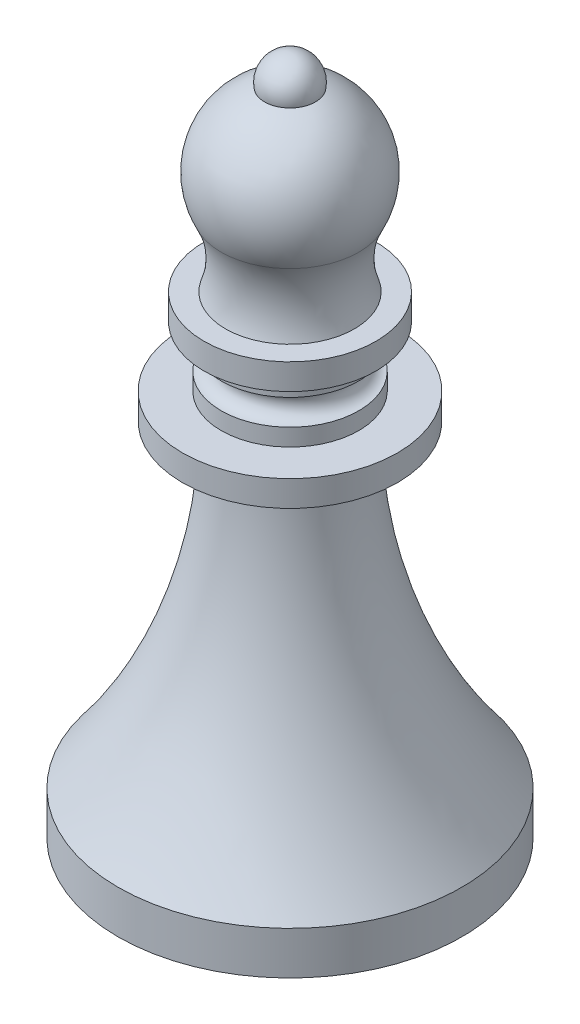
ISO-10303-21;
HEADER;
FILE_DESCRIPTION(('STEP AP214'),'2;1');
FILE_NAME('part.step','',(''),(''),'','','');
FILE_SCHEMA(('AUTOMOTIVE_DESIGN { 1 0 10303 214 1 1 1 1 }'));
ENDSEC;
DATA;
#1=APPLICATION_CONTEXT('core data for automotive mechanical design processes');
#2=APPLICATION_PROTOCOL_DEFINITION('international standard','automotive_design',2000,#1);
#3=PRODUCT_CONTEXT('',#1,'mechanical');
#4=PRODUCT('Part','Part','',(#3));
#5=PRODUCT_RELATED_PRODUCT_CATEGORY('part','',(#4));
#6=PRODUCT_DEFINITION_FORMATION('','',#4);
#7=PRODUCT_DEFINITION_CONTEXT('part definition',#1,'design');
#8=PRODUCT_DEFINITION('design','',#6,#7);
#9=PRODUCT_DEFINITION_SHAPE('','',#8);
#10=(LENGTH_UNIT() NAMED_UNIT(*) SI_UNIT(.MILLI.,.METRE.));
#11=(NAMED_UNIT(*) PLANE_ANGLE_UNIT() SI_UNIT($,.RADIAN.));
#12=(NAMED_UNIT(*) SI_UNIT($,.STERADIAN.) SOLID_ANGLE_UNIT());
#13=UNCERTAINTY_MEASURE_WITH_UNIT(LENGTH_MEASURE(1.E-05),#10,'distance_accuracy_value','');
#14=(GEOMETRIC_REPRESENTATION_CONTEXT(3) GLOBAL_UNCERTAINTY_ASSIGNED_CONTEXT((#13)) GLOBAL_UNIT_ASSIGNED_CONTEXT((#10,
#11,#12)) REPRESENTATION_CONTEXT('',''));
#15=CARTESIAN_POINT('',(0.,0.,0.));
#16=DIRECTION('',(0.,0.,1.));
#17=DIRECTION('',(1.,0.,0.));
#18=AXIS2_PLACEMENT_3D('',#15,#16,#17);
#19=CARTESIAN_POINT('',(0.,-0.204926779867239,0.));
#20=DIRECTION('',(0.,1.,0.));
#21=DIRECTION('',(0.,0.,1.));
#22=AXIS2_PLACEMENT_3D('',#19,#20,#21);
#23=TOROIDAL_SURFACE('',#22,40.4994167315929,36.);
#24=CARTESIAN_POINT('',(0.,-1.23431286965975,0.));
#25=DIRECTION('',(0.,1.,0.));
#26=DIRECTION('',(0.,0.,1.));
#27=AXIS2_PLACEMENT_3D('',#24,#25,#26);
#28=CIRCLE('',#27,4.51413690388919);
#29=CARTESIAN_POINT('',(0.,-1.23431286965975,4.51413690388919));
#30=VERTEX_POINT('',#29);
#31=EDGE_CURVE('E10',#30,#30,#28,.F.);
#32=ORIENTED_EDGE('',*,*,#31,.T.);
#33=EDGE_LOOP('',(#32));
#34=FACE_BOUND('',#33,.T.);
#35=CARTESIAN_POINT('',(0.,-22.2,0.));
#36=DIRECTION('',(0.,1.,0.));
#37=DIRECTION('',(0.,0.,1.));
#38=AXIS2_PLACEMENT_3D('',#35,#36,#37);
#39=CIRCLE('',#38,12.);
#40=CARTESIAN_POINT('',(0.,-22.2,12.));
#41=VERTEX_POINT('',#40);
#42=EDGE_CURVE('E87',#41,#41,#39,.T.);
#43=ORIENTED_EDGE('',*,*,#42,.T.);
#44=EDGE_LOOP('',(#43));
#45=FACE_BOUND('',#44,.T.);
#46=ADVANCED_FACE('F37',(#34,#45),#23,.F.);
#47=CARTESIAN_POINT('',(4.5,0.,0.));
#48=DIRECTION('',(0.,1.,0.));
#49=DIRECTION('',(0.,0.,1.));
#50=AXIS2_PLACEMENT_3D('',#47,#48,#49);
#51=PLANE('',#50);
#52=CARTESIAN_POINT('',(0.,0.,0.));
#53=DIRECTION('',(0.,1.,0.));
#54=DIRECTION('',(0.,0.,1.));
#55=AXIS2_PLACEMENT_3D('',#52,#53,#54);
#56=CIRCLE('',#55,5.71364623147932);
#57=CARTESIAN_POINT('',(0.,0.,5.71364623147932));
#58=VERTEX_POINT('',#57);
#59=EDGE_CURVE('E44',#58,#58,#56,.T.);
#60=ORIENTED_EDGE('',*,*,#59,.T.);
#61=EDGE_LOOP('',(#60));
#62=FACE_BOUND('',#61,.T.);
#63=CARTESIAN_POINT('',(0.,0.,0.));
#64=DIRECTION('',(0.,1.,0.));
#65=DIRECTION('',(0.,0.,1.));
#66=AXIS2_PLACEMENT_3D('',#63,#64,#65);
#67=CIRCLE('',#66,7.5);
#68=CARTESIAN_POINT('',(0.,0.,7.5));
#69=VERTEX_POINT('',#68);
#70=EDGE_CURVE('E48',#69,#69,#67,.T.);
#71=ORIENTED_EDGE('',*,*,#70,.F.);
#72=EDGE_LOOP('',(#71));
#73=FACE_BOUND('',#72,.T.);
#74=ADVANCED_FACE('F109',(#62,#73),#51,.F.);
#75=CARTESIAN_POINT('',(0.,27.858167310788,0.));
#76=DIRECTION('',(0.,1.,0.));
#77=DIRECTION('',(0.,0.,1.));
#78=AXIS2_PLACEMENT_3D('',#75,#76,#77);
#79=CYLINDRICAL_SURFACE('',#78,7.5);
#80=CARTESIAN_POINT('',(0.,1.8,0.));
#81=DIRECTION('',(0.,1.,0.));
#82=DIRECTION('',(0.,0.,1.));
#83=AXIS2_PLACEMENT_3D('',#80,#81,#82);
#84=CIRCLE('',#83,7.5);
#85=CARTESIAN_POINT('',(0.,1.8,7.5));
#86=VERTEX_POINT('',#85);
#87=EDGE_CURVE('E52',#86,#86,#84,.T.);
#88=ORIENTED_EDGE('',*,*,#87,.F.);
#89=EDGE_LOOP('',(#88));
#90=FACE_BOUND('',#89,.T.);
#91=ORIENTED_EDGE('',*,*,#70,.T.);
#92=EDGE_LOOP('',(#91));
#93=FACE_BOUND('',#92,.T.);
#94=ADVANCED_FACE('F113',(#90,#93),#79,.T.);
#95=CARTESIAN_POINT('',(7.5,1.8,0.));
#96=DIRECTION('',(0.,-1.,0.));
#97=DIRECTION('',(0.,0.,-1.));
#98=AXIS2_PLACEMENT_3D('',#95,#96,#97);
#99=PLANE('',#98);
#100=CARTESIAN_POINT('',(0.,1.8,0.));
#101=DIRECTION('',(0.,1.,0.));
#102=DIRECTION('',(0.,0.,1.));
#103=AXIS2_PLACEMENT_3D('',#100,#101,#102);
#104=CIRCLE('',#103,4.8);
#105=CARTESIAN_POINT('',(0.,1.8,4.8));
#106=VERTEX_POINT('',#105);
#107=EDGE_CURVE('E57',#106,#106,#104,.T.);
#108=ORIENTED_EDGE('',*,*,#107,.F.);
#109=EDGE_LOOP('',(#108));
#110=FACE_BOUND('',#109,.T.);
#111=ORIENTED_EDGE('',*,*,#87,.T.);
#112=EDGE_LOOP('',(#111));
#113=FACE_BOUND('',#112,.T.);
#114=ADVANCED_FACE('F118',(#110,#113),#99,.F.);
#115=CARTESIAN_POINT('',(0.,27.858167310788,0.));
#116=DIRECTION('',(0.,1.,0.));
#117=DIRECTION('',(0.,0.,1.));
#118=AXIS2_PLACEMENT_3D('',#115,#116,#117);
#119=CYLINDRICAL_SURFACE('',#118,4.8);
#120=CARTESIAN_POINT('',(0.,3.,0.));
#121=DIRECTION('',(0.,1.,0.));
#122=DIRECTION('',(0.,0.,1.));
#123=AXIS2_PLACEMENT_3D('',#120,#121,#122);
#124=CIRCLE('',#123,4.8);
#125=CARTESIAN_POINT('',(0.,3.,4.8));
#126=VERTEX_POINT('',#125);
#127=EDGE_CURVE('E60',#126,#126,#124,.T.);
#128=ORIENTED_EDGE('',*,*,#127,.F.);
#129=EDGE_LOOP('',(#128));
#130=FACE_BOUND('',#129,.T.);
#131=ORIENTED_EDGE('',*,*,#107,.T.);
#132=EDGE_LOOP('',(#131));
#133=FACE_BOUND('',#132,.T.);
#134=ADVANCED_FACE('F122',(#130,#133),#119,.T.);
#135=CARTESIAN_POINT('',(0.,3.9,0.));
#136=DIRECTION('',(0.,1.,0.));
#137=DIRECTION('',(0.,0.,1.));
#138=AXIS2_PLACEMENT_3D('',#135,#136,#137);
#139=TOROIDAL_SURFACE('',#138,4.8,0.9);
#140=CARTESIAN_POINT('',(0.,4.8,0.));
#141=DIRECTION('',(0.,1.,0.));
#142=DIRECTION('',(0.,0.,1.));
#143=AXIS2_PLACEMENT_3D('',#140,#141,#142);
#144=CIRCLE('',#143,4.80000000000001);
#145=CARTESIAN_POINT('',(0.,4.8,4.80000000000001));
#146=VERTEX_POINT('',#145);
#147=EDGE_CURVE('E63',#146,#146,#144,.T.);
#148=ORIENTED_EDGE('',*,*,#147,.F.);
#149=EDGE_LOOP('',(#148));
#150=FACE_BOUND('',#149,.T.);
#151=ORIENTED_EDGE('',*,*,#127,.T.);
#152=EDGE_LOOP('',(#151));
#153=FACE_BOUND('',#152,.T.);
#154=ADVANCED_FACE('F126',(#150,#153),#139,.F.);
#155=CARTESIAN_POINT('',(0.,27.858167310788,0.));
#156=DIRECTION('',(0.,1.,0.));
#157=DIRECTION('',(0.,0.,1.));
#158=AXIS2_PLACEMENT_3D('',#155,#156,#157);
#159=CYLINDRICAL_SURFACE('',#158,4.80000000000001);
#160=CARTESIAN_POINT('',(0.,6.,0.));
#161=DIRECTION('',(0.,1.,0.));
#162=DIRECTION('',(0.,0.,1.));
#163=AXIS2_PLACEMENT_3D('',#160,#161,#162);
#164=CIRCLE('',#163,4.80000000000001);
#165=CARTESIAN_POINT('',(0.,6.,4.80000000000001));
#166=VERTEX_POINT('',#165);
#167=EDGE_CURVE('E66',#166,#166,#164,.T.);
#168=ORIENTED_EDGE('',*,*,#167,.F.);
#169=EDGE_LOOP('',(#168));
#170=FACE_BOUND('',#169,.T.);
#171=ORIENTED_EDGE('',*,*,#147,.T.);
#172=EDGE_LOOP('',(#171));
#173=FACE_BOUND('',#172,.T.);
#174=ADVANCED_FACE('F130',(#170,#173),#159,.T.);
#175=CARTESIAN_POINT('',(4.80000000000001,6.,0.));
#176=DIRECTION('',(0.,1.,0.));
#177=DIRECTION('',(0.,0.,1.));
#178=AXIS2_PLACEMENT_3D('',#175,#176,#177);
#179=PLANE('',#178);
#180=CARTESIAN_POINT('',(0.,6.,0.));
#181=DIRECTION('',(0.,1.,0.));
#182=DIRECTION('',(0.,0.,1.));
#183=AXIS2_PLACEMENT_3D('',#180,#181,#182);
#184=CIRCLE('',#183,6.);
#185=CARTESIAN_POINT('',(0.,6.,6.));
#186=VERTEX_POINT('',#185);
#187=EDGE_CURVE('E69',#186,#186,#184,.T.);
#188=ORIENTED_EDGE('',*,*,#187,.F.);
#189=EDGE_LOOP('',(#188));
#190=FACE_BOUND('',#189,.T.);
#191=ORIENTED_EDGE('',*,*,#167,.T.);
#192=EDGE_LOOP('',(#191));
#193=FACE_BOUND('',#192,.T.);
#194=ADVANCED_FACE('F134',(#190,#193),#179,.F.);
#195=CARTESIAN_POINT('',(0.,27.858167310788,0.));
#196=DIRECTION('',(0.,1.,0.));
#197=DIRECTION('',(0.,0.,1.));
#198=AXIS2_PLACEMENT_3D('',#195,#196,#197);
#199=CYLINDRICAL_SURFACE('',#198,6.);
#200=CARTESIAN_POINT('',(0.,7.8,0.));
#201=DIRECTION('',(0.,1.,0.));
#202=DIRECTION('',(0.,0.,1.));
#203=AXIS2_PLACEMENT_3D('',#200,#201,#202);
#204=CIRCLE('',#203,6.);
#205=CARTESIAN_POINT('',(0.,7.8,6.));
#206=VERTEX_POINT('',#205);
#207=EDGE_CURVE('E72',#206,#206,#204,.T.);
#208=ORIENTED_EDGE('',*,*,#207,.F.);
#209=EDGE_LOOP('',(#208));
#210=FACE_BOUND('',#209,.T.);
#211=ORIENTED_EDGE('',*,*,#187,.T.);
#212=EDGE_LOOP('',(#211));
#213=FACE_BOUND('',#212,.T.);
#214=ADVANCED_FACE('F138',(#210,#213),#199,.T.);
#215=CARTESIAN_POINT('',(6.,7.8,0.));
#216=DIRECTION('',(0.,-1.,0.));
#217=DIRECTION('',(0.,0.,-1.));
#218=AXIS2_PLACEMENT_3D('',#215,#216,#217);
#219=PLANE('',#218);
#220=CARTESIAN_POINT('',(0.,7.8,0.));
#221=DIRECTION('',(0.,1.,0.));
#222=DIRECTION('',(0.,0.,1.));
#223=AXIS2_PLACEMENT_3D('',#220,#221,#222);
#224=CIRCLE('',#223,4.5);
#225=CARTESIAN_POINT('',(0.,7.8,4.5));
#226=VERTEX_POINT('',#225);
#227=EDGE_CURVE('E75',#226,#226,#224,.T.);
#228=ORIENTED_EDGE('',*,*,#227,.F.);
#229=EDGE_LOOP('',(#228));
#230=FACE_BOUND('',#229,.T.);
#231=ORIENTED_EDGE('',*,*,#207,.T.);
#232=EDGE_LOOP('',(#231));
#233=FACE_BOUND('',#232,.T.);
#234=ADVANCED_FACE('F142',(#230,#233),#219,.F.);
#235=CARTESIAN_POINT('',(0.,9.84587314111305,0.));
#236=DIRECTION('',(0.,1.,0.));
#237=DIRECTION('',(0.,0.,1.));
#238=AXIS2_PLACEMENT_3D('',#235,#236,#237);
#239=TOROIDAL_SURFACE('',#238,10.1404257898205,6.);
#240=CARTESIAN_POINT('',(0.,12.5873552806949,0.));
#241=DIRECTION('',(0.,1.,0.));
#242=DIRECTION('',(0.,0.,1.));
#243=AXIS2_PLACEMENT_3D('',#240,#241,#242);
#244=CIRCLE('',#243,4.80335958465182);
#245=CARTESIAN_POINT('',(4.80335958465182,12.5873552806949,0.));
#246=VERTEX_POINT('',#245);
#247=EDGE_CURVE('E78',#246,#246,#244,.T.);
#248=ORIENTED_EDGE('',*,*,#247,.F.);
#249=EDGE_LOOP('',(#248));
#250=FACE_BOUND('',#249,.T.);
#251=ORIENTED_EDGE('',*,*,#227,.T.);
#252=EDGE_LOOP('',(#251));
#253=FACE_BOUND('',#252,.T.);
#254=ADVANCED_FACE('F146',(#250,#253),#239,.F.);
#255=CARTESIAN_POINT('',(0.,15.0546892063186,0.));
#256=DIRECTION('',(0.,1.,0.));
#257=DIRECTION('',(1.,0.,0.));
#258=AXIS2_PLACEMENT_3D('',#255,#256,#257);
#259=SPHERICAL_SURFACE('',#258,5.4);
#260=CARTESIAN_POINT('',(0.,20.1546892063186,0.));
#261=DIRECTION('',(0.,1.,0.));
#262=DIRECTION('',(0.,0.,1.));
#263=AXIS2_PLACEMENT_3D('',#260,#261,#262);
#264=CIRCLE('',#263,1.77482393492989);
#265=CARTESIAN_POINT('',(1.77482393492989,20.1546892063186,0.));
#266=VERTEX_POINT('',#265);
#267=EDGE_CURVE('E81',#266,#266,#264,.T.);
#268=CARTESIAN_POINT('',(1.77482393492989,20.1546892063186,0.));
#269=CARTESIAN_POINT('',(1.86569112995369,20.123069785297,0.));
#270=CARTESIAN_POINT('',(1.95571128805558,20.0890171256981,0.));
#271=CARTESIAN_POINT('',(2.13380479159958,20.0161533132991,0.));
#272=CARTESIAN_POINT('',(2.2218781370417,19.977342160499,0.));
#273=CARTESIAN_POINT('',(2.39582527645026,19.8950693456509,0.));
#274=CARTESIAN_POINT('',(2.48169907041671,19.851607683603,0.));
#275=CARTESIAN_POINT('',(2.65100214061098,19.7601587593303,0.));
#276=CARTESIAN_POINT('',(2.73443141683882,19.7121714971055,0.));
#277=CARTESIAN_POINT('',(2.89860706832508,19.6118082321738,0.));
#278=CARTESIAN_POINT('',(2.9793534435835,19.5594322294668,0.));
#279=CARTESIAN_POINT('',(3.13793268004005,19.4504411402906,0.));
#280=CARTESIAN_POINT('',(3.21576554123817,19.3938260538212,0.));
#281=CARTESIAN_POINT('',(3.36829542968311,19.2765184918637,0.));
#282=CARTESIAN_POINT('',(3.44299245692992,19.2158260163755,0.));
#283=CARTESIAN_POINT('',(3.58903732213749,19.0905370361344,0.));
#284=CARTESIAN_POINT('',(3.66038516009826,19.0259405313814,0.));
#285=CARTESIAN_POINT('',(3.79952785562313,18.8930279984048,0.));
#286=CARTESIAN_POINT('',(3.86732271318724,18.8247119701812,0.));
#287=CARTESIAN_POINT('',(3.99916580572989,18.6845555214723,0.));
#288=CARTESIAN_POINT('',(4.06321404070843,18.612715100987,0.));
#289=CARTESIAN_POINT('',(4.18738094721329,18.4657150653166,0.));
#290=CARTESIAN_POINT('',(4.2474996187396,18.3905554501314,0.));
#291=CARTESIAN_POINT('',(4.36363568151653,18.2371317033283,0.));
#292=CARTESIAN_POINT('',(4.41965307276716,18.1588675717104,0.));
#293=CARTESIAN_POINT('',(4.52742657263666,17.9994583377068,0.));
#294=CARTESIAN_POINT('',(4.57918268125553,17.918313235321,0.));
#295=CARTESIAN_POINT('',(4.67828578500071,17.7533738343642,0.));
#296=CARTESIAN_POINT('',(4.72563278012701,17.669579535793,0.));
#297=CARTESIAN_POINT('',(4.81578241976681,17.4995810839392,0.));
#298=CARTESIAN_POINT('',(4.85858506428031,17.4133769306565,0.));
#299=CARTESIAN_POINT('',(4.93952374559333,17.2388049941168,0.));
#300=CARTESIAN_POINT('',(4.97765978239286,17.1504372108598,0.));
#301=CARTESIAN_POINT('',(5.04915632039826,16.9717904190803,0.));
#302=CARTESIAN_POINT('',(5.08251682160414,16.8815114105577,0.));
#303=CARTESIAN_POINT('',(5.14436700089462,16.6993000319842,0.));
#304=CARTESIAN_POINT('',(5.17285667897922,16.6073676619334,0.));
#305=CARTESIAN_POINT('',(5.22488383702099,16.4221121465337,0.));
#306=CARTESIAN_POINT('',(5.24842131697815,16.328789001185,0.));
#307=CARTESIAN_POINT('',(5.29047684871218,16.1410184938881,0.));
#308=CARTESIAN_POINT('',(5.30899490048904,16.0465711319401,0.));
#309=CARTESIAN_POINT('',(5.34095868278968,15.8568219612415,0.));
#310=CARTESIAN_POINT('',(5.35440441331345,15.7615201524911,0.));
#311=CARTESIAN_POINT('',(5.3761851481022,15.5703342985361,0.));
#312=CARTESIAN_POINT('',(5.38452015236718,15.4744502533316,0.));
#313=CARTESIAN_POINT('',(5.39605562736348,15.2823737998691,0.));
#314=CARTESIAN_POINT('',(5.3992560980948,15.1861813916112,0.));
#315=CARTESIAN_POINT('',(5.40051336460139,14.9937629661763,0.));
#316=CARTESIAN_POINT('',(5.39857016037666,14.8975369489995,0.));
#317=CARTESIAN_POINT('',(5.38954562706032,14.7053261560179,0.));
#318=CARTESIAN_POINT('',(5.3824642979687,14.6093413802132,0.));
#319=CARTESIAN_POINT('',(5.36318374235182,14.4178872306147,0.));
#320=CARTESIAN_POINT('',(5.35098451582655,14.3224178568209,0.));
#321=CARTESIAN_POINT('',(5.32150300605479,14.1322672019627,0.));
#322=CARTESIAN_POINT('',(5.30422072280829,14.0375859208983,0.));
#323=CARTESIAN_POINT('',(5.26462247754217,13.849281882899,0.));
#324=CARTESIAN_POINT('',(5.24230651552254,13.7556591259642,0.));
#325=CARTESIAN_POINT('',(5.1927045992574,13.5697395751055,0.));
#326=CARTESIAN_POINT('',(5.1654186450119,13.4774427811815,0.));
#327=CARTESIAN_POINT('',(5.10595488445527,13.2944386924067,0.));
#328=CARTESIAN_POINT('',(5.07377707814416,13.2037313975558,0.));
#329=CARTESIAN_POINT('',(5.00462076395,13.02416573386,0.));
#330=CARTESIAN_POINT('',(4.96764225606695,12.9353073650151,0.));
#331=CARTESIAN_POINT('',(4.88899299263362,12.7596920908408,0.));
#332=CARTESIAN_POINT('',(4.84732223708335,12.6729351855115,0.));
#333=CARTESIAN_POINT('',(4.80335958465182,12.5873552806949,0.));
#334=B_SPLINE_CURVE_WITH_KNOTS('',3,(#268,#269,#270,#271,#272,#273,#274,#275,#276,#277,#278,
#279,#280,#281,#282,#283,#284,#285,#286,#287,#288,#289,#290,#291,#292,#293,#294,#295,#296,#297,
#298,#299,#300,#301,#302,#303,#304,#305,#306,#307,#308,#309,#310,#311,#312,#313,#314,#315,#316,
#317,#318,#319,#320,#321,#322,#323,#324,#325,#326,#327,#328,#329,#330,#331,#332,#333),
.UNSPECIFIED.,.F.,.F.,(4,2,2,2,2,2,2,2,2,2,2,2,2,2,2,2,2,2,2,2,2,2,2,2,2,2,2,2,2,2,2,2,4),(0.,
0.28859945445454,0.57719890890908,0.865798363363619,1.15439781781816,1.4429972722727,
1.73159672672724,2.02019618118178,2.30879563563632,2.59739509009086,2.8859945445454,
3.17459399899994,3.46319345345448,3.75179290790902,4.04039236236355,4.3289918168181,
4.61759127127264,4.90619072572717,5.19479018018171,5.48338963463625,5.77198908909079,
6.06058854354534,6.34918799799987,6.63778745245441,6.92638690690895,7.21498636136349,
7.50358581581803,7.79218527027257,8.08078472472711,8.36938417918165,8.65798363363619,
8.94658308809073,9.23518254254527),.UNSPECIFIED.);
#335=EDGE_CURVE('BSEAM105',#266,#246,#334,.T.);
#336=ORIENTED_EDGE('',*,*,#267,.F.);
#337=ORIENTED_EDGE('',*,*,#247,.T.);
#338=ORIENTED_EDGE('',*,*,#335,.T.);
#339=ORIENTED_EDGE('',*,*,#335,.F.);
#340=EDGE_LOOP('',(#336,#338,#337,#339));
#341=FACE_BOUND('',#340,.T.);
#342=ADVANCED_FACE('F105',(#341),#259,.T.);
#343=CARTESIAN_POINT('',(0.,20.4546892063186,0.));
#344=DIRECTION('',(0.,1.,0.));
#345=DIRECTION('',(1.,0.,0.));
#346=AXIS2_PLACEMENT_3D('',#343,#344,#345);
#347=SPHERICAL_SURFACE('',#346,1.8);
#348=ORIENTED_EDGE('',*,*,#267,.T.);
#349=EDGE_LOOP('',(#348));
#350=FACE_BOUND('',#349,.T.);
#351=ADVANCED_FACE('F100',(#350),#347,.T.);
#352=CARTESIAN_POINT('',(12.,-25.2,0.));
#353=DIRECTION('',(0.,1.,0.));
#354=DIRECTION('',(0.,0.,1.));
#355=AXIS2_PLACEMENT_3D('',#352,#353,#354);
#356=PLANE('',#355);
#357=CARTESIAN_POINT('',(0.,-25.2,0.));
#358=DIRECTION('',(0.,1.,0.));
#359=DIRECTION('',(0.,0.,1.));
#360=AXIS2_PLACEMENT_3D('',#357,#358,#359);
#361=CIRCLE('',#360,12.);
#362=CARTESIAN_POINT('',(0.,-25.2,12.));
#363=VERTEX_POINT('',#362);
#364=EDGE_CURVE('E84',#363,#363,#361,.T.);
#365=ORIENTED_EDGE('',*,*,#364,.F.);
#366=EDGE_LOOP('',(#365));
#367=FACE_BOUND('',#366,.T.);
#368=ADVANCED_FACE('F95',(#367),#356,.F.);
#369=CARTESIAN_POINT('',(0.,27.858167310788,0.));
#370=DIRECTION('',(0.,1.,0.));
#371=DIRECTION('',(0.,0.,1.));
#372=AXIS2_PLACEMENT_3D('',#369,#370,#371);
#373=CYLINDRICAL_SURFACE('',#372,12.);
#374=ORIENTED_EDGE('',*,*,#42,.F.);
#375=EDGE_LOOP('',(#374));
#376=FACE_BOUND('',#375,.T.);
#377=ORIENTED_EDGE('',*,*,#364,.T.);
#378=EDGE_LOOP('',(#377));
#379=FACE_BOUND('',#378,.T.);
#380=ADVANCED_FACE('F92',(#376,#379),#373,.T.);
#381=CARTESIAN_POINT('',(0.,-1.2,0.));
#382=DIRECTION('',(0.,-1.,0.));
#383=DIRECTION('',(0.,0.,-1.));
#384=AXIS2_PLACEMENT_3D('',#381,#382,#383);
#385=TOROIDAL_SURFACE('',#384,5.71364623147932,1.2);
#386=ORIENTED_EDGE('',*,*,#31,.F.);
#387=EDGE_LOOP('',(#386));
#388=FACE_BOUND('',#387,.T.);
#389=ORIENTED_EDGE('',*,*,#59,.F.);
#390=EDGE_LOOP('',(#389));
#391=FACE_BOUND('',#390,.T.);
#392=ADVANCED_FACE('F39',(#388,#391),#385,.F.);
#393=CLOSED_SHELL('',(#46,#74,#94,#114,#134,#154,#174,#194,#214,#234,#254,#342,#351,#368,#380,#392));
#394=MANIFOLD_SOLID_BREP('B2',#393);
#395=ADVANCED_BREP_SHAPE_REPRESENTATION('',(#18,#394),#14);
#396=SHAPE_DEFINITION_REPRESENTATION(#9,#395);
ENDSEC;
END-ISO-10303-21;
